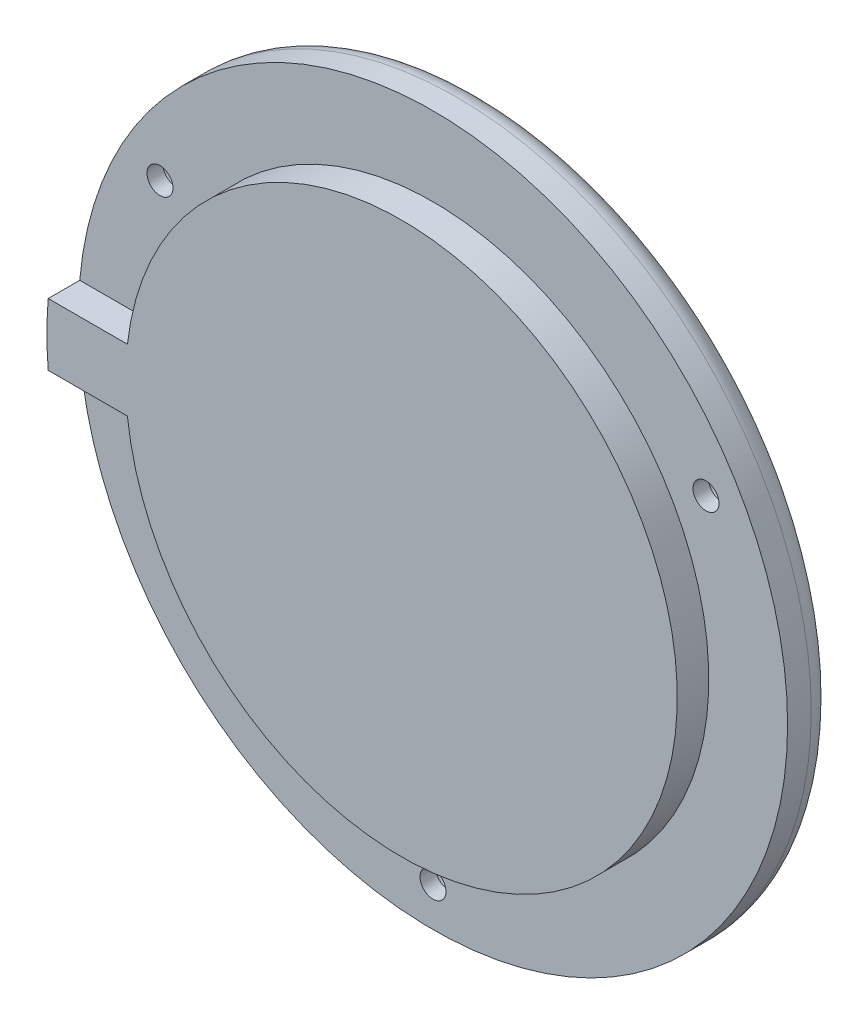
ISO-10303-21;
HEADER;
FILE_DESCRIPTION(('STEP AP214'),'2;1');
FILE_NAME('part.step','',(''),(''),'','','');
FILE_SCHEMA(('AUTOMOTIVE_DESIGN { 1 0 10303 214 1 1 1 1 }'));
ENDSEC;
DATA;
#1=APPLICATION_CONTEXT('core data for automotive mechanical design processes');
#2=APPLICATION_PROTOCOL_DEFINITION('international standard','automotive_design',2000,#1);
#3=PRODUCT_CONTEXT('',#1,'mechanical');
#4=PRODUCT('Part','Part','',(#3));
#5=PRODUCT_RELATED_PRODUCT_CATEGORY('part','',(#4));
#6=PRODUCT_DEFINITION_FORMATION('','',#4);
#7=PRODUCT_DEFINITION_CONTEXT('part definition',#1,'design');
#8=PRODUCT_DEFINITION('design','',#6,#7);
#9=PRODUCT_DEFINITION_SHAPE('','',#8);
#10=(LENGTH_UNIT() NAMED_UNIT(*) SI_UNIT(.MILLI.,.METRE.));
#11=(NAMED_UNIT(*) PLANE_ANGLE_UNIT() SI_UNIT($,.RADIAN.));
#12=(NAMED_UNIT(*) SI_UNIT($,.STERADIAN.) SOLID_ANGLE_UNIT());
#13=UNCERTAINTY_MEASURE_WITH_UNIT(LENGTH_MEASURE(1.E-05),#10,'distance_accuracy_value','');
#14=(GEOMETRIC_REPRESENTATION_CONTEXT(3) GLOBAL_UNCERTAINTY_ASSIGNED_CONTEXT((#13)) GLOBAL_UNIT_ASSIGNED_CONTEXT((#10,
#11,#12)) REPRESENTATION_CONTEXT('',''));
#15=CARTESIAN_POINT('',(0.,0.,0.));
#16=DIRECTION('',(0.,0.,1.));
#17=DIRECTION('',(1.,0.,0.));
#18=AXIS2_PLACEMENT_3D('',#15,#16,#17);
#19=CARTESIAN_POINT('',(0.,0.,6.));
#20=DIRECTION('',(0.,0.,-1.));
#21=DIRECTION('',(-1.,0.,0.));
#22=AXIS2_PLACEMENT_3D('',#19,#20,#21);
#23=CYLINDRICAL_SURFACE('',#22,45.);
#24=CARTESIAN_POINT('',(0.,0.,3.));
#25=DIRECTION('',(0.,0.,1.));
#26=DIRECTION('',(1.,0.,0.));
#27=AXIS2_PLACEMENT_3D('',#24,#25,#26);
#28=CIRCLE('',#27,45.);
#29=CARTESIAN_POINT('',(45.,0.,3.));
#30=VERTEX_POINT('',#29);
#31=EDGE_CURVE('E120',#30,#30,#28,.T.);
#32=ORIENTED_EDGE('',*,*,#31,.T.);
#33=EDGE_LOOP('',(#32));
#34=FACE_BOUND('',#33,.T.);
#35=CARTESIAN_POINT('',(0.,0.,6.));
#36=DIRECTION('',(0.,0.,1.));
#37=DIRECTION('',(1.,0.,0.));
#38=AXIS2_PLACEMENT_3D('',#35,#36,#37);
#39=CIRCLE('',#38,45.);
#40=CARTESIAN_POINT('',(-44.8263036620241,-3.95,6.));
#41=VERTEX_POINT('',#40);
#42=CARTESIAN_POINT('',(-44.8263036620241,3.95,6.));
#43=VERTEX_POINT('',#42);
#44=EDGE_CURVE('E118',#41,#43,#39,.T.);
#45=ORIENTED_EDGE('',*,*,#44,.F.);
#46=DIRECTION('',(0.,0.,-1.));
#47=VECTOR('',#46,1.);
#48=CARTESIAN_POINT('',(-44.8263036620241,-3.95,10.));
#49=LINE('',#48,#47);
#50=CARTESIAN_POINT('',(-44.8263036620241,-3.95,10.));
#51=VERTEX_POINT('',#50);
#52=EDGE_CURVE('E100',#51,#41,#49,.T.);
#53=ORIENTED_EDGE('',*,*,#52,.F.);
#54=CARTESIAN_POINT('',(0.,0.,10.));
#55=DIRECTION('',(0.,0.,1.));
#56=DIRECTION('',(1.,0.,0.));
#57=AXIS2_PLACEMENT_3D('',#54,#55,#56);
#58=CIRCLE('',#57,45.);
#59=CARTESIAN_POINT('',(-44.8263036620241,3.95,10.));
#60=VERTEX_POINT('',#59);
#61=EDGE_CURVE('E106',#60,#51,#58,.T.);
#62=ORIENTED_EDGE('',*,*,#61,.F.);
#63=DIRECTION('',(0.,0.,-1.));
#64=VECTOR('',#63,1.);
#65=CARTESIAN_POINT('',(-44.8263036620241,3.95,10.));
#66=LINE('',#65,#64);
#67=EDGE_CURVE('E249',#60,#43,#66,.T.);
#68=ORIENTED_EDGE('',*,*,#67,.T.);
#69=EDGE_LOOP('',(#45,#53,#62,#68));
#70=FACE_BOUND('',#69,.T.);
#71=ADVANCED_FACE('F32',(#34,#70),#23,.T.);
#72=CARTESIAN_POINT('',(0.,0.,6.));
#73=DIRECTION('',(0.,0.,1.));
#74=DIRECTION('',(1.,0.,0.));
#75=AXIS2_PLACEMENT_3D('',#72,#73,#74);
#76=PLANE('',#75);
#77=CARTESIAN_POINT('',(-34.6410161513777,19.9999999999998,6.));
#78=DIRECTION('',(0.,0.,1.));
#79=DIRECTION('',(1.,0.,0.));
#80=AXIS2_PLACEMENT_3D('',#77,#78,#79);
#81=CIRCLE('',#80,1.65);
#82=CARTESIAN_POINT('',(-32.9910161513777,19.9999999999998,6.));
#83=VERTEX_POINT('',#82);
#84=EDGE_CURVE('E238',#83,#83,#81,.T.);
#85=ORIENTED_EDGE('',*,*,#84,.F.);
#86=EDGE_LOOP('',(#85));
#87=FACE_BOUND('',#86,.T.);
#88=CARTESIAN_POINT('',(34.6410161513775,20.0000000000004,6.));
#89=DIRECTION('',(0.,0.,1.));
#90=DIRECTION('',(1.,0.,0.));
#91=AXIS2_PLACEMENT_3D('',#88,#89,#90);
#92=CIRCLE('',#91,1.64999999999976);
#93=CARTESIAN_POINT('',(36.2910161513773,20.0000000000004,6.));
#94=VERTEX_POINT('',#93);
#95=EDGE_CURVE('E237',#94,#94,#92,.T.);
#96=ORIENTED_EDGE('',*,*,#95,.F.);
#97=EDGE_LOOP('',(#96));
#98=FACE_BOUND('',#97,.T.);
#99=CARTESIAN_POINT('',(4.75656640289828E-13,-40.,6.));
#100=DIRECTION('',(0.,0.,1.));
#101=DIRECTION('',(1.,0.,0.));
#102=AXIS2_PLACEMENT_3D('',#99,#100,#101);
#103=CIRCLE('',#102,1.65);
#104=CARTESIAN_POINT('',(1.65000000000048,-40.,6.));
#105=VERTEX_POINT('',#104);
#106=EDGE_CURVE('E241',#105,#105,#103,.T.);
#107=ORIENTED_EDGE('',*,*,#106,.F.);
#108=EDGE_LOOP('',(#107));
#109=FACE_BOUND('',#108,.T.);
#110=DIRECTION('',(-1.,0.,0.));
#111=VECTOR('',#110,1.);
#112=CARTESIAN_POINT('',(-34.7763928549239,3.95,6.));
#113=LINE('',#112,#111);
#114=CARTESIAN_POINT('',(-34.7763928549239,3.95,6.));
#115=VERTEX_POINT('',#114);
#116=EDGE_CURVE('E115',#115,#43,#113,.T.);
#117=ORIENTED_EDGE('',*,*,#116,.F.);
#118=CARTESIAN_POINT('',(0.,0.,6.));
#119=DIRECTION('',(0.,0.,1.));
#120=DIRECTION('',(1.,0.,0.));
#121=AXIS2_PLACEMENT_3D('',#118,#119,#120);
#122=CIRCLE('',#121,35.);
#123=CARTESIAN_POINT('',(-34.7763928549239,-3.94999999999999,6.));
#124=VERTEX_POINT('',#123);
#125=EDGE_CURVE('E251',#124,#115,#122,.T.);
#126=ORIENTED_EDGE('',*,*,#125,.F.);
#127=DIRECTION('',(1.,0.,0.));
#128=VECTOR('',#127,1.);
#129=CARTESIAN_POINT('',(-34.7763928549239,-3.95,6.));
#130=LINE('',#129,#128);
#131=EDGE_CURVE('E245',#41,#124,#130,.T.);
#132=ORIENTED_EDGE('',*,*,#131,.F.);
#133=ORIENTED_EDGE('',*,*,#44,.T.);
#134=EDGE_LOOP('',(#117,#126,#132,#133));
#135=FACE_BOUND('',#134,.T.);
#136=ADVANCED_FACE('F190',(#87,#98,#109,#135),#76,.T.);
#137=CARTESIAN_POINT('',(0.,0.,0.));
#138=DIRECTION('',(0.,0.,1.));
#139=DIRECTION('',(1.,0.,0.));
#140=AXIS2_PLACEMENT_3D('',#137,#138,#139);
#141=PLANE('',#140);
#142=CARTESIAN_POINT('',(4.75656640289828E-13,-40.,0.));
#143=DIRECTION('',(0.,0.,1.));
#144=DIRECTION('',(1.,0.,0.));
#145=AXIS2_PLACEMENT_3D('',#142,#143,#144);
#146=CIRCLE('',#145,2.95);
#147=CARTESIAN_POINT('',(-2.22129911642855,-41.94121875,0.));
#148=VERTEX_POINT('',#147);
#149=CARTESIAN_POINT('',(2.22129911642955,-41.94121875,0.));
#150=VERTEX_POINT('',#149);
#151=EDGE_CURVE('E211',#148,#150,#146,.F.);
#152=ORIENTED_EDGE('',*,*,#151,.F.);
#153=CARTESIAN_POINT('',(0.,0.,0.));
#154=DIRECTION('',(0.,0.,1.));
#155=DIRECTION('',(1.,0.,0.));
#156=AXIS2_PLACEMENT_3D('',#153,#154,#155);
#157=CIRCLE('',#156,42.);
#158=CARTESIAN_POINT('',(-37.4328104613947,19.0469079107685,0.));
#159=VERTEX_POINT('',#158);
#160=EDGE_CURVE('E131',#148,#159,#157,.F.);
#161=ORIENTED_EDGE('',*,*,#160,.T.);
#162=CARTESIAN_POINT('',(-34.6410161513771,20.0000000000001,0.));
#163=DIRECTION('',(0.,0.,1.));
#164=DIRECTION('',(1.,0.,0.));
#165=AXIS2_PLACEMENT_3D('',#162,#163,#164);
#166=CIRCLE('',#165,2.9500000000005);
#167=CARTESIAN_POINT('',(-35.2115113449653,22.8943108392321,0.));
#168=VERTEX_POINT('',#167);
#169=EDGE_CURVE('E210',#168,#159,#166,.F.);
#170=ORIENTED_EDGE('',*,*,#169,.F.);
#171=CARTESIAN_POINT('',(0.,0.,0.));
#172=DIRECTION('',(0.,0.,1.));
#173=DIRECTION('',(1.,0.,0.));
#174=AXIS2_PLACEMENT_3D('',#171,#172,#173);
#175=CIRCLE('',#174,42.);
#176=CARTESIAN_POINT('',(35.2115113449652,22.8943108392322,0.));
#177=VERTEX_POINT('',#176);
#178=EDGE_CURVE('E129',#168,#177,#175,.F.);
#179=ORIENTED_EDGE('',*,*,#178,.T.);
#180=CARTESIAN_POINT('',(34.6410161513781,20.0000000000001,0.));
#181=DIRECTION('',(0.,0.,1.));
#182=DIRECTION('',(1.,0.,0.));
#183=AXIS2_PLACEMENT_3D('',#180,#181,#182);
#184=CIRCLE('',#183,2.95000000000046);
#185=CARTESIAN_POINT('',(37.4328104613954,19.0469079107673,0.));
#186=VERTEX_POINT('',#185);
#187=EDGE_CURVE('E220',#186,#177,#184,.F.);
#188=ORIENTED_EDGE('',*,*,#187,.F.);
#189=CARTESIAN_POINT('',(0.,0.,0.));
#190=DIRECTION('',(0.,0.,1.));
#191=DIRECTION('',(1.,0.,0.));
#192=AXIS2_PLACEMENT_3D('',#189,#190,#191);
#193=CIRCLE('',#192,42.);
#194=EDGE_CURVE('E56',#186,#150,#193,.F.);
#195=ORIENTED_EDGE('',*,*,#194,.T.);
#196=EDGE_LOOP('',(#152,#161,#170,#179,#188,#195));
#197=FACE_BOUND('',#196,.T.);
#198=ADVANCED_FACE('F189',(#197),#141,.F.);
#199=CARTESIAN_POINT('',(-34.7763928549239,-3.95,10.));
#200=DIRECTION('',(0.,1.,0.));
#201=DIRECTION('',(0.,0.,1.));
#202=AXIS2_PLACEMENT_3D('',#199,#200,#201);
#203=PLANE('',#202);
#204=ORIENTED_EDGE('',*,*,#131,.T.);
#205=DIRECTION('',(0.,0.,-1.));
#206=VECTOR('',#205,1.);
#207=CARTESIAN_POINT('',(-34.7763928549239,-3.94999999999999,10.));
#208=LINE('',#207,#206);
#209=CARTESIAN_POINT('',(-34.7763928549239,-3.94999999999999,10.));
#210=VERTEX_POINT('',#209);
#211=EDGE_CURVE('E102',#210,#124,#208,.T.);
#212=ORIENTED_EDGE('',*,*,#211,.F.);
#213=DIRECTION('',(1.,0.,0.));
#214=VECTOR('',#213,1.);
#215=CARTESIAN_POINT('',(-34.7763928549239,-3.95,10.));
#216=LINE('',#215,#214);
#217=EDGE_CURVE('E95',#51,#210,#216,.T.);
#218=ORIENTED_EDGE('',*,*,#217,.F.);
#219=ORIENTED_EDGE('',*,*,#52,.T.);
#220=EDGE_LOOP('',(#204,#212,#218,#219));
#221=FACE_BOUND('',#220,.T.);
#222=ADVANCED_FACE('F98',(#221),#203,.F.);
#223=CARTESIAN_POINT('',(0.,0.,10.));
#224=DIRECTION('',(0.,0.,-1.));
#225=DIRECTION('',(-1.,0.,0.));
#226=AXIS2_PLACEMENT_3D('',#223,#224,#225);
#227=CYLINDRICAL_SURFACE('',#226,35.);
#228=ORIENTED_EDGE('',*,*,#125,.T.);
#229=DIRECTION('',(0.,0.,-1.));
#230=VECTOR('',#229,1.);
#231=CARTESIAN_POINT('',(-34.7763928549239,3.95,10.));
#232=LINE('',#231,#230);
#233=CARTESIAN_POINT('',(-34.7763928549239,3.95,10.));
#234=VERTEX_POINT('',#233);
#235=EDGE_CURVE('E122',#234,#115,#232,.T.);
#236=ORIENTED_EDGE('',*,*,#235,.F.);
#237=CARTESIAN_POINT('',(0.,0.,10.));
#238=DIRECTION('',(0.,0.,1.));
#239=DIRECTION('',(1.,0.,0.));
#240=AXIS2_PLACEMENT_3D('',#237,#238,#239);
#241=CIRCLE('',#240,35.);
#242=EDGE_CURVE('E105',#210,#234,#241,.T.);
#243=ORIENTED_EDGE('',*,*,#242,.F.);
#244=ORIENTED_EDGE('',*,*,#211,.T.);
#245=EDGE_LOOP('',(#228,#236,#243,#244));
#246=FACE_BOUND('',#245,.T.);
#247=ADVANCED_FACE('F182',(#246),#227,.T.);
#248=CARTESIAN_POINT('',(-34.7763928549239,3.95,10.));
#249=DIRECTION('',(0.,-1.,0.));
#250=DIRECTION('',(0.,0.,-1.));
#251=AXIS2_PLACEMENT_3D('',#248,#249,#250);
#252=PLANE('',#251);
#253=ORIENTED_EDGE('',*,*,#116,.T.);
#254=ORIENTED_EDGE('',*,*,#67,.F.);
#255=DIRECTION('',(-1.,0.,0.));
#256=VECTOR('',#255,1.);
#257=CARTESIAN_POINT('',(-34.7763928549239,3.95,10.));
#258=LINE('',#257,#256);
#259=EDGE_CURVE('E111',#234,#60,#258,.T.);
#260=ORIENTED_EDGE('',*,*,#259,.F.);
#261=ORIENTED_EDGE('',*,*,#235,.T.);
#262=EDGE_LOOP('',(#253,#254,#260,#261));
#263=FACE_BOUND('',#262,.T.);
#264=ADVANCED_FACE('F179',(#263),#252,.F.);
#265=CARTESIAN_POINT('',(0.,0.,10.));
#266=DIRECTION('',(0.,0.,1.));
#267=DIRECTION('',(1.,0.,0.));
#268=AXIS2_PLACEMENT_3D('',#265,#266,#267);
#269=PLANE('',#268);
#270=ORIENTED_EDGE('',*,*,#61,.T.);
#271=ORIENTED_EDGE('',*,*,#217,.T.);
#272=ORIENTED_EDGE('',*,*,#242,.T.);
#273=ORIENTED_EDGE('',*,*,#259,.T.);
#274=EDGE_LOOP('',(#270,#271,#272,#273));
#275=FACE_BOUND('',#274,.T.);
#276=ADVANCED_FACE('F109',(#275),#269,.T.);
#277=CARTESIAN_POINT('',(4.75656640289828E-13,-40.,4.));
#278=DIRECTION('',(0.,0.,1.));
#279=DIRECTION('',(1.,0.,0.));
#280=AXIS2_PLACEMENT_3D('',#277,#278,#279);
#281=CYLINDRICAL_SURFACE('',#280,1.65);
#282=CARTESIAN_POINT('',(4.75656640289828E-13,-40.,4.));
#283=DIRECTION('',(0.,0.,1.));
#284=DIRECTION('',(1.,0.,0.));
#285=AXIS2_PLACEMENT_3D('',#282,#283,#284);
#286=CIRCLE('',#285,1.65);
#287=CARTESIAN_POINT('',(1.65000000000048,-40.,4.));
#288=VERTEX_POINT('',#287);
#289=EDGE_CURVE('E234',#288,#288,#286,.F.);
#290=ORIENTED_EDGE('',*,*,#289,.T.);
#291=EDGE_LOOP('',(#290));
#292=FACE_BOUND('',#291,.T.);
#293=ORIENTED_EDGE('',*,*,#106,.T.);
#294=EDGE_LOOP('',(#293));
#295=FACE_BOUND('',#294,.T.);
#296=ADVANCED_FACE('F172',(#292,#295),#281,.F.);
#297=CARTESIAN_POINT('',(34.6410161513775,20.0000000000004,4.));
#298=DIRECTION('',(0.,0.,1.));
#299=DIRECTION('',(1.,0.,0.));
#300=AXIS2_PLACEMENT_3D('',#297,#298,#299);
#301=CYLINDRICAL_SURFACE('',#300,1.64999999999976);
#302=CARTESIAN_POINT('',(34.6410161513775,20.0000000000004,4.));
#303=DIRECTION('',(0.,0.,1.));
#304=DIRECTION('',(1.,0.,0.));
#305=AXIS2_PLACEMENT_3D('',#302,#303,#304);
#306=CIRCLE('',#305,1.64999999999976);
#307=CARTESIAN_POINT('',(36.2910161513773,20.0000000000004,4.));
#308=VERTEX_POINT('',#307);
#309=EDGE_CURVE('E217',#308,#308,#306,.F.);
#310=ORIENTED_EDGE('',*,*,#309,.T.);
#311=EDGE_LOOP('',(#310));
#312=FACE_BOUND('',#311,.T.);
#313=ORIENTED_EDGE('',*,*,#95,.T.);
#314=EDGE_LOOP('',(#313));
#315=FACE_BOUND('',#314,.T.);
#316=ADVANCED_FACE('F168',(#312,#315),#301,.F.);
#317=CARTESIAN_POINT('',(-34.6410161513777,19.9999999999998,4.));
#318=DIRECTION('',(0.,0.,1.));
#319=DIRECTION('',(1.,0.,0.));
#320=AXIS2_PLACEMENT_3D('',#317,#318,#319);
#321=CYLINDRICAL_SURFACE('',#320,1.65);
#322=CARTESIAN_POINT('',(-34.6410161513777,19.9999999999998,4.));
#323=DIRECTION('',(0.,0.,1.));
#324=DIRECTION('',(1.,0.,0.));
#325=AXIS2_PLACEMENT_3D('',#322,#323,#324);
#326=CIRCLE('',#325,1.65);
#327=CARTESIAN_POINT('',(-32.9910161513777,19.9999999999998,4.));
#328=VERTEX_POINT('',#327);
#329=EDGE_CURVE('E213',#328,#328,#326,.F.);
#330=ORIENTED_EDGE('',*,*,#329,.T.);
#331=EDGE_LOOP('',(#330));
#332=FACE_BOUND('',#331,.T.);
#333=ORIENTED_EDGE('',*,*,#84,.T.);
#334=EDGE_LOOP('',(#333));
#335=FACE_BOUND('',#334,.T.);
#336=ADVANCED_FACE('F161',(#332,#335),#321,.F.);
#337=CARTESIAN_POINT('',(4.75656640289828E-13,-40.,4.));
#338=DIRECTION('',(0.,0.,1.));
#339=DIRECTION('',(1.,0.,0.));
#340=AXIS2_PLACEMENT_3D('',#337,#338,#339);
#341=PLANE('',#340);
#342=CARTESIAN_POINT('',(4.75656640289828E-13,-40.,4.));
#343=DIRECTION('',(0.,0.,1.));
#344=DIRECTION('',(1.,0.,0.));
#345=AXIS2_PLACEMENT_3D('',#342,#343,#344);
#346=CIRCLE('',#345,2.95);
#347=CARTESIAN_POINT('',(2.95000000000048,-40.,4.));
#348=VERTEX_POINT('',#347);
#349=EDGE_CURVE('E230',#348,#348,#346,.T.);
#350=ORIENTED_EDGE('',*,*,#349,.F.);
#351=EDGE_LOOP('',(#350));
#352=FACE_BOUND('',#351,.T.);
#353=ORIENTED_EDGE('',*,*,#289,.F.);
#354=EDGE_LOOP('',(#353));
#355=FACE_BOUND('',#354,.T.);
#356=ADVANCED_FACE('F158',(#352,#355),#341,.F.);
#357=CARTESIAN_POINT('',(4.75656640289828E-13,-40.,-8.34386001800267));
#358=DIRECTION('',(0.,0.,1.));
#359=DIRECTION('',(1.,0.,0.));
#360=AXIS2_PLACEMENT_3D('',#357,#358,#359);
#361=CYLINDRICAL_SURFACE('',#360,2.95);
#362=ORIENTED_EDGE('',*,*,#151,.T.);
#363=CARTESIAN_POINT('',(2.22129911642955,-41.94121875,0.));
#364=CARTESIAN_POINT('',(2.16739029768606,-42.0029100490054,3.26990393713383E-06));
#365=CARTESIAN_POINT('',(2.1109507775941,-42.0622997804275,0.00172528820969306));
#366=CARTESIAN_POINT('',(1.99344550176875,-42.1760880245445,0.00782061646207712));
#367=CARTESIAN_POINT('',(1.9323828443067,-42.2304898268613,0.0121921643073818));
#368=CARTESIAN_POINT('',(1.74301141112886,-42.3855768705025,0.0280897590364105));
#369=CARTESIAN_POINT('',(1.60833561644108,-42.4783530348738,0.0424040412499001));
#370=CARTESIAN_POINT('',(1.32599085981469,-42.6402139582472,0.0726036225540201));
#371=CARTESIAN_POINT('',(1.17834194180141,-42.709334484415,0.0884865026563637));
#372=CARTESIAN_POINT('',(0.873385670279144,-42.8224295942644,0.116885298445901));
#373=CARTESIAN_POINT('',(0.716080749658852,-42.8664104834667,0.129402058005615));
#374=CARTESIAN_POINT('',(0.393241920582806,-42.9283639099497,0.147574921936161));
#375=CARTESIAN_POINT('',(0.227614150287202,-42.9458869762083,0.15311220343167));
#376=CARTESIAN_POINT('',(-0.104258368157669,-42.952823336639,0.155265638673683));
#377=CARTESIAN_POINT('',(-0.270502959628569,-42.94224333835,0.151883921176387));
#378=CARTESIAN_POINT('',(-0.591594085618295,-42.8944368329749,0.137539103133034));
#379=CARTESIAN_POINT('',(-0.746626488371594,-42.8583437488454,0.126899131020585));
#380=CARTESIAN_POINT('',(-1.04869058392778,-42.7618730358477,0.1013110959229));
#381=CARTESIAN_POINT('',(-1.19571315407049,-42.7014683481129,0.086358237958555));
#382=CARTESIAN_POINT('',(-1.4833312520821,-42.5552179063676,0.0558941820299486));
#383=CARTESIAN_POINT('',(-1.62350662758355,-42.4685367460468,0.040382209153143));
#384=CARTESIAN_POINT('',(-1.82145905030772,-42.3219680649679,0.0214493053950741));
#385=CARTESIAN_POINT('',(-1.88533985602694,-42.2704074132377,0.0158639053839037));
#386=CARTESIAN_POINT('',(-2.0086568644435,-42.1620625034769,0.00690519028863684));
#387=CARTESIAN_POINT('',(-2.06809575608725,-42.1052814528584,0.00353052714917138));
#388=CARTESIAN_POINT('',(-2.1579870672693,-42.0119278679699,0.00057901047851933));
#389=CARTESIAN_POINT('',(-2.19007819139894,-41.9769502177359,7.59709554178514E-08));
#390=CARTESIAN_POINT('',(-2.22129911642855,-41.94121875,0.));
#391=B_SPLINE_CURVE_WITH_KNOTS('',3,(#363,#364,#365,#366,#367,#368,#369,#370,#371,#372,#373,
#374,#375,#376,#377,#378,#379,#380,#381,#382,#383,#384,#385,#386,#387,#388,#389,#390),
.UNSPECIFIED.,.F.,.F.,(4,2,2,2,2,2,2,2,2,2,2,2,2,4),(0.,0.245573651378273,0.490984160001868,
0.980981258210926,1.47023417664767,1.95936432681777,2.45671395524713,2.9539448887099,
3.43037146615692,3.90732978029093,4.40140913953916,4.6480088402231,4.89445802989273,
5.03680720297823),.UNSPECIFIED.);
#392=EDGE_CURVE('E11',#150,#148,#391,.T.);
#393=ORIENTED_EDGE('',*,*,#392,.T.);
#394=EDGE_LOOP('',(#362,#393));
#395=FACE_BOUND('',#394,.T.);
#396=ORIENTED_EDGE('',*,*,#349,.T.);
#397=EDGE_LOOP('',(#396));
#398=FACE_BOUND('',#397,.T.);
#399=ADVANCED_FACE('F160',(#395,#398),#361,.F.);
#400=CARTESIAN_POINT('',(-34.6410161513771,20.0000000000001,4.));
#401=DIRECTION('',(0.,0.,1.));
#402=DIRECTION('',(1.,0.,0.));
#403=AXIS2_PLACEMENT_3D('',#400,#401,#402);
#404=PLANE('',#403);
#405=CARTESIAN_POINT('',(-34.6410161513771,20.0000000000001,4.));
#406=DIRECTION('',(0.,0.,1.));
#407=DIRECTION('',(1.,0.,0.));
#408=AXIS2_PLACEMENT_3D('',#405,#406,#407);
#409=CIRCLE('',#408,2.9500000000005);
#410=CARTESIAN_POINT('',(-31.6910161513766,20.0000000000001,4.));
#411=VERTEX_POINT('',#410);
#412=EDGE_CURVE('E214',#411,#411,#409,.T.);
#413=ORIENTED_EDGE('',*,*,#412,.F.);
#414=EDGE_LOOP('',(#413));
#415=FACE_BOUND('',#414,.T.);
#416=ORIENTED_EDGE('',*,*,#329,.F.);
#417=EDGE_LOOP('',(#416));
#418=FACE_BOUND('',#417,.T.);
#419=ADVANCED_FACE('F149',(#415,#418),#404,.F.);
#420=CARTESIAN_POINT('',(-34.6410161513771,20.0000000000001,-8.34386001800267));
#421=DIRECTION('',(0.,0.,1.));
#422=DIRECTION('',(1.,0.,0.));
#423=AXIS2_PLACEMENT_3D('',#420,#421,#422);
#424=CYLINDRICAL_SURFACE('',#423,2.9500000000005);
#425=ORIENTED_EDGE('',*,*,#169,.T.);
#426=CARTESIAN_POINT('',(-37.4328104613947,19.0469079107685,0.));
#427=CARTESIAN_POINT('',(-37.4592822841542,19.1244399667911,3.26990393733091E-06));
#428=CARTESIAN_POINT('',(-37.4824955402436,19.2030128906792,0.00172528820969378));
#429=CARTESIAN_POINT('',(-37.5222864123883,19.3616695666812,0.00782061646207952));
#430=CARTESIAN_POINT('',(-37.5388684264753,19.4417522804243,0.0121921643073853));
#431=CARTESIAN_POINT('',(-37.5784920294775,19.683296274128,0.0280897590364184));
#432=CARTESIAN_POINT('',(-37.5915006473448,19.8463170157882,0.0424040412499125));
#433=CARTESIAN_POINT('',(-37.590503940553,20.1717652093387,0.0726036225540416));
#434=CARTESIAN_POINT('',(-37.5765396131306,20.3341931862634,0.0884865026563899));
#435=CARTESIAN_POINT('',(-37.5220047155428,20.6548406193698,0.116885298445937));
#436=CARTESIAN_POINT('',(-37.4814408225629,20.8130611213685,0.129402058005655));
#437=CARTESIAN_POINT('',(-37.3736746492106,21.1236244619179,0.147574921936208));
#438=CARTESIAN_POINT('',(-37.306036184595,21.2758238516954,0.153112203431718));
#439=CARTESIAN_POINT('',(-37.1461069897153,21.566702063702,0.155265638673732));
#440=CARTESIAN_POINT('',(-37.0538221466896,21.7053841040131,0.151883921176434));
#441=CARTESIAN_POINT('',(-36.8518749355736,21.9595539233624,0.137539103133077));
#442=CARTESIAN_POINT('',(-36.7431012064399,22.0757693804918,0.126899131020625));
#443=CARTESIAN_POINT('',(-36.5085230704846,22.2891292043158,0.101311095922932));
#444=CARTESIAN_POINT('',(-36.3826997913272,22.3862521411216,0.0863582379585836));
#445=CARTESIAN_POINT('',(-36.1122341444552,22.5622114997153,0.0558941820299683));
#446=CARTESIAN_POINT('',(-35.9670783698372,22.6402663557242,0.0403822091531578));
#447=CARTESIAN_POINT('',(-35.7411699572615,22.7384138420045,0.0214493053950829));
#448=CARTESIAN_POINT('',(-35.6645767201678,22.7679559167065,0.0158639053839107));
#449=CARTESIAN_POINT('',(-35.509088771736,22.8205791238335,0.00690519028864068));
#450=CARTESIAN_POINT('',(-35.4301954936249,22.8436641886606,0.00353052714917376));
#451=CARTESIAN_POINT('',(-35.3044032619861,22.8748355552795,0.000579010478519818));
#452=CARTESIAN_POINT('',(-35.2580661662539,22.8851384588948,7.59709554159216E-08));
#453=CARTESIAN_POINT('',(-35.2115113449653,22.8943108392321,0.));
#454=B_SPLINE_CURVE_WITH_KNOTS('',3,(#426,#427,#428,#429,#430,#431,#432,#433,#434,#435,#436,
#437,#438,#439,#440,#441,#442,#443,#444,#445,#446,#447,#448,#449,#450,#451,#452,#453),
.UNSPECIFIED.,.F.,.F.,(4,2,2,2,2,2,2,2,2,2,2,2,2,4),(0.,0.245573651378314,0.490984160001947,
0.980981258211086,1.47023417664791,1.95936432681808,2.45671395524753,2.95394488871039,
3.43037146615749,3.90732978029157,4.40140913953987,4.64800884022386,4.89445802989353,
5.03680720297909),.UNSPECIFIED.);
#455=EDGE_CURVE('E134',#159,#168,#454,.T.);
#456=ORIENTED_EDGE('',*,*,#455,.T.);
#457=EDGE_LOOP('',(#425,#456));
#458=FACE_BOUND('',#457,.T.);
#459=ORIENTED_EDGE('',*,*,#412,.T.);
#460=EDGE_LOOP('',(#459));
#461=FACE_BOUND('',#460,.T.);
#462=ADVANCED_FACE('F143',(#458,#461),#424,.F.);
#463=CARTESIAN_POINT('',(34.6410161513781,20.0000000000001,4.));
#464=DIRECTION('',(0.,0.,1.));
#465=DIRECTION('',(1.,0.,0.));
#466=AXIS2_PLACEMENT_3D('',#463,#464,#465);
#467=PLANE('',#466);
#468=CARTESIAN_POINT('',(34.6410161513781,20.0000000000001,4.));
#469=DIRECTION('',(0.,0.,1.));
#470=DIRECTION('',(1.,0.,0.));
#471=AXIS2_PLACEMENT_3D('',#468,#469,#470);
#472=CIRCLE('',#471,2.95000000000046);
#473=CARTESIAN_POINT('',(37.5910161513786,20.0000000000001,4.));
#474=VERTEX_POINT('',#473);
#475=EDGE_CURVE('E223',#474,#474,#472,.T.);
#476=ORIENTED_EDGE('',*,*,#475,.F.);
#477=EDGE_LOOP('',(#476));
#478=FACE_BOUND('',#477,.T.);
#479=ORIENTED_EDGE('',*,*,#309,.F.);
#480=EDGE_LOOP('',(#479));
#481=FACE_BOUND('',#480,.T.);
#482=ADVANCED_FACE('F148',(#478,#481),#467,.F.);
#483=CARTESIAN_POINT('',(34.6410161513781,20.0000000000001,-8.34386001800267));
#484=DIRECTION('',(0.,0.,1.));
#485=DIRECTION('',(1.,0.,0.));
#486=AXIS2_PLACEMENT_3D('',#483,#484,#485);
#487=CYLINDRICAL_SURFACE('',#486,2.95000000000046);
#488=ORIENTED_EDGE('',*,*,#187,.T.);
#489=CARTESIAN_POINT('',(35.2115113449652,22.8943108392322,0.));
#490=CARTESIAN_POINT('',(35.2918919864682,22.8784700822151,3.26990393715699E-06));
#491=CARTESIAN_POINT('',(35.3715447626496,22.8592868897491,0.001725288209695));
#492=CARTESIAN_POINT('',(35.5288409106196,22.8144184578642,0.00782061646208604));
#493=CARTESIAN_POINT('',(35.6064855821687,22.788737546438,0.0121921643073957));
#494=CARTESIAN_POINT('',(35.8354806183488,22.7022805963756,0.0280897590364431));
#495=CARTESIAN_POINT('',(35.9831650309039,22.6320360190868,0.04240404124995));
#496=CARTESIAN_POINT('',(36.2645130807386,22.4684487489098,0.072603622554115));
#497=CARTESIAN_POINT('',(36.3981976713296,22.375141298153,0.0884865026564863));
#498=CARTESIAN_POINT('',(36.6486190452641,22.1675889748961,0.116885298446081));
#499=CARTESIAN_POINT('',(36.7653600729046,22.0533493620998,0.129402058005824));
#500=CARTESIAN_POINT('',(36.9804327286285,21.8047394480335,0.147574921936431));
#501=CARTESIAN_POINT('',(37.0784220343086,21.6700631245147,0.15311220343197));
#502=CARTESIAN_POINT('',(37.2503653578739,21.3861212729388,0.155265638674031));
#503=CARTESIAN_POINT('',(37.3243251063192,21.2368592343387,0.151883921176752));
#504=CARTESIAN_POINT('',(37.4434690211932,20.9348829096143,0.137539103133418));
#505=CARTESIAN_POINT('',(37.4897276948128,20.7825743683555,0.126899131020972));
#506=CARTESIAN_POINT('',(37.5572136544139,20.4727438315339,0.101311095923276));
#507=CARTESIAN_POINT('',(37.5784129453992,20.3152162069931,0.0863582379589175));
#508=CARTESIAN_POINT('',(37.5955653965391,19.9930064066543,0.0558941820302633));
#509=CARTESIAN_POINT('',(37.5905849974226,19.8282703903246,0.0403822091534228));
#510=CARTESIAN_POINT('',(37.5626290075713,19.5835542229654,0.0214493053952855));
#511=CARTESIAN_POINT('',(37.5499165761968,19.5024514965332,0.0158639053840897));
#512=CARTESIAN_POINT('',(37.5177456361816,19.3414833796453,0.00690519028876538));
#513=CARTESIAN_POINT('',(37.4982912497144,19.2616172641998,0.00353052714926794));
#514=CARTESIAN_POINT('',(37.4623903292574,19.1370923126915,0.000579010478541297));
#515=CARTESIAN_POINT('',(37.4481443576547,19.0918117588414,7.59709552160499E-08));
#516=CARTESIAN_POINT('',(37.4328104613954,19.0469079107673,0.));
#517=B_SPLINE_CURVE_WITH_KNOTS('',3,(#489,#490,#491,#492,#493,#494,#495,#496,#497,#498,#499,
#500,#501,#502,#503,#504,#505,#506,#507,#508,#509,#510,#511,#512,#513,#514,#515,#516),
.UNSPECIFIED.,.F.,.F.,(4,2,2,2,2,2,2,2,2,2,2,2,2,4),(0.,0.245573651378305,0.490984160001929,
0.980981258211038,1.47023417664783,1.95936432681798,2.45671395524744,2.95394488871033,
3.43037146615737,3.90732978029141,4.40140913953966,4.64800884022361,4.89445802989326,
5.03680720298145),.UNSPECIFIED.);
#518=EDGE_CURVE('E45',#177,#186,#517,.T.);
#519=ORIENTED_EDGE('',*,*,#518,.T.);
#520=EDGE_LOOP('',(#488,#519));
#521=FACE_BOUND('',#520,.T.);
#522=ORIENTED_EDGE('',*,*,#475,.T.);
#523=EDGE_LOOP('',(#522));
#524=FACE_BOUND('',#523,.T.);
#525=ADVANCED_FACE('F152',(#521,#524),#487,.F.);
#526=CARTESIAN_POINT('',(0.,0.,3.));
#527=DIRECTION('',(0.,0.,1.));
#528=DIRECTION('',(1.,0.,0.));
#529=AXIS2_PLACEMENT_3D('',#526,#527,#528);
#530=TOROIDAL_SURFACE('',#529,42.,3.);
#531=ORIENTED_EDGE('',*,*,#455,.F.);
#532=ORIENTED_EDGE('',*,*,#160,.F.);
#533=ORIENTED_EDGE('',*,*,#392,.F.);
#534=ORIENTED_EDGE('',*,*,#194,.F.);
#535=ORIENTED_EDGE('',*,*,#518,.F.);
#536=ORIENTED_EDGE('',*,*,#178,.F.);
#537=EDGE_LOOP('',(#531,#532,#533,#534,#535,#536));
#538=FACE_BOUND('',#537,.T.);
#539=ORIENTED_EDGE('',*,*,#31,.F.);
#540=EDGE_LOOP('',(#539));
#541=FACE_BOUND('',#540,.T.);
#542=ADVANCED_FACE('F34',(#538,#541),#530,.T.);
#543=CLOSED_SHELL('',(#71,#136,#198,#222,#247,#264,#276,#296,#316,#336,#356,#399,#419,#462,#482,
#525,#542));
#544=MANIFOLD_SOLID_BREP('B2',#543);
#545=ADVANCED_BREP_SHAPE_REPRESENTATION('',(#18,#544),#14);
#546=SHAPE_DEFINITION_REPRESENTATION(#9,#545);
ENDSEC;
END-ISO-10303-21;
